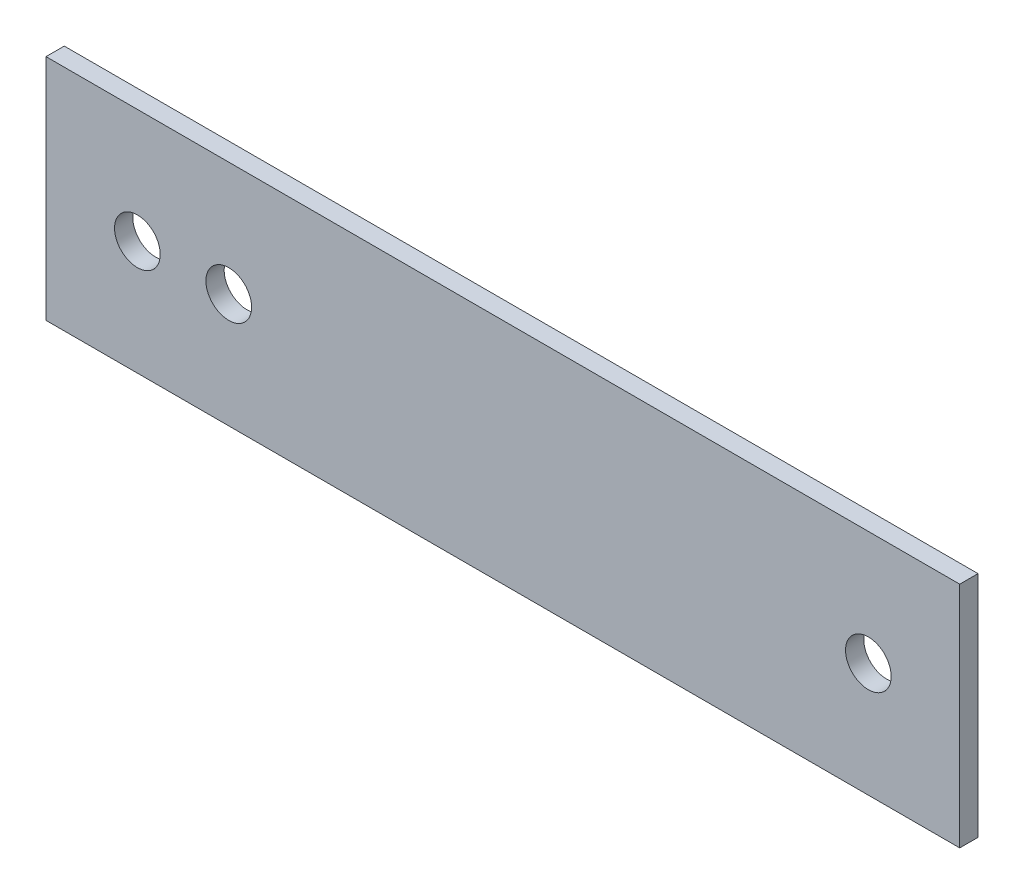
ISO-10303-21;
HEADER;
FILE_DESCRIPTION(('STEP AP214'),'2;1');
FILE_NAME('part.step','',(''),(''),'','','');
FILE_SCHEMA(('AUTOMOTIVE_DESIGN { 1 0 10303 214 1 1 1 1 }'));
ENDSEC;
DATA;
#1=APPLICATION_CONTEXT('core data for automotive mechanical design processes');
#2=APPLICATION_PROTOCOL_DEFINITION('international standard','automotive_design',2000,#1);
#3=PRODUCT_CONTEXT('',#1,'mechanical');
#4=PRODUCT('Part','Part','',(#3));
#5=PRODUCT_RELATED_PRODUCT_CATEGORY('part','',(#4));
#6=PRODUCT_DEFINITION_FORMATION('','',#4);
#7=PRODUCT_DEFINITION_CONTEXT('part definition',#1,'design');
#8=PRODUCT_DEFINITION('design','',#6,#7);
#9=PRODUCT_DEFINITION_SHAPE('','',#8);
#10=(LENGTH_UNIT() NAMED_UNIT(*) SI_UNIT(.MILLI.,.METRE.));
#11=(NAMED_UNIT(*) PLANE_ANGLE_UNIT() SI_UNIT($,.RADIAN.));
#12=(NAMED_UNIT(*) SI_UNIT($,.STERADIAN.) SOLID_ANGLE_UNIT());
#13=UNCERTAINTY_MEASURE_WITH_UNIT(LENGTH_MEASURE(1.E-05),#10,'distance_accuracy_value','');
#14=(GEOMETRIC_REPRESENTATION_CONTEXT(3) GLOBAL_UNCERTAINTY_ASSIGNED_CONTEXT((#13)) GLOBAL_UNIT_ASSIGNED_CONTEXT((#10,
#11,#12)) REPRESENTATION_CONTEXT('',''));
#15=CARTESIAN_POINT('',(0.,0.,0.));
#16=DIRECTION('',(0.,0.,1.));
#17=DIRECTION('',(1.,0.,0.));
#18=AXIS2_PLACEMENT_3D('',#15,#16,#17);
#19=CARTESIAN_POINT('',(0.,0.,2.));
#20=DIRECTION('',(0.,0.,1.));
#21=DIRECTION('',(1.,0.,0.));
#22=AXIS2_PLACEMENT_3D('',#19,#20,#21);
#23=PLANE('',#22);
#24=CARTESIAN_POINT('',(-8.88960426693684,-2.80448717948718,2.));
#25=DIRECTION('',(0.,0.,1.));
#26=DIRECTION('',(1.,0.,0.));
#27=AXIS2_PLACEMENT_3D('',#24,#25,#26);
#28=CIRCLE('',#27,2.5);
#29=CARTESIAN_POINT('',(-6.38960426693684,-2.80448717948718,2.));
#30=VERTEX_POINT('',#29);
#31=EDGE_CURVE('E134',#30,#30,#28,.T.);
#32=ORIENTED_EDGE('',*,*,#31,.F.);
#33=EDGE_LOOP('',(#32));
#34=FACE_BOUND('',#33,.T.);
#35=DIRECTION('',(0.,-1.,0.));
#36=VECTOR('',#35,1.);
#37=CARTESIAN_POINT('',(-28.8896042669368,9.69551282051282,2.));
#38=LINE('',#37,#36);
#39=CARTESIAN_POINT('',(-28.8896042669368,9.69551282051282,2.));
#40=VERTEX_POINT('',#39);
#41=CARTESIAN_POINT('',(-28.8896042669368,-15.3044871794872,2.));
#42=VERTEX_POINT('',#41);
#43=EDGE_CURVE('E92',#40,#42,#38,.T.);
#44=ORIENTED_EDGE('',*,*,#43,.T.);
#45=DIRECTION('',(1.,0.,0.));
#46=VECTOR('',#45,1.);
#47=CARTESIAN_POINT('',(-28.8896042669368,-15.3044871794872,2.));
#48=LINE('',#47,#46);
#49=CARTESIAN_POINT('',(71.1103957330632,-15.3044871794872,2.));
#50=VERTEX_POINT('',#49);
#51=EDGE_CURVE('E87',#42,#50,#48,.T.);
#52=ORIENTED_EDGE('',*,*,#51,.T.);
#53=DIRECTION('',(0.,1.,0.));
#54=VECTOR('',#53,1.);
#55=CARTESIAN_POINT('',(71.1103957330632,9.69551282051282,2.));
#56=LINE('',#55,#54);
#57=CARTESIAN_POINT('',(71.1103957330632,9.69551282051282,2.));
#58=VERTEX_POINT('',#57);
#59=EDGE_CURVE('E90',#50,#58,#56,.T.);
#60=ORIENTED_EDGE('',*,*,#59,.T.);
#61=DIRECTION('',(-1.,0.,0.));
#62=VECTOR('',#61,1.);
#63=CARTESIAN_POINT('',(-28.8896042669368,9.69551282051282,2.));
#64=LINE('',#63,#62);
#65=EDGE_CURVE('E57',#58,#40,#64,.T.);
#66=ORIENTED_EDGE('',*,*,#65,.T.);
#67=EDGE_LOOP('',(#44,#52,#60,#66));
#68=FACE_BOUND('',#67,.T.);
#69=CARTESIAN_POINT('',(-18.8896042669368,-2.80448717948718,2.));
#70=DIRECTION('',(0.,0.,1.));
#71=DIRECTION('',(1.,0.,0.));
#72=AXIS2_PLACEMENT_3D('',#69,#70,#71);
#73=CIRCLE('',#72,2.5);
#74=CARTESIAN_POINT('',(-16.3896042669368,-2.80448717948718,2.));
#75=VERTEX_POINT('',#74);
#76=EDGE_CURVE('E112',#75,#75,#73,.T.);
#77=ORIENTED_EDGE('',*,*,#76,.F.);
#78=EDGE_LOOP('',(#77));
#79=FACE_BOUND('',#78,.T.);
#80=CARTESIAN_POINT('',(61.1103957330632,-2.80448717948718,2.));
#81=DIRECTION('',(0.,0.,1.));
#82=DIRECTION('',(1.,0.,0.));
#83=AXIS2_PLACEMENT_3D('',#80,#81,#82);
#84=CIRCLE('',#83,2.5);
#85=CARTESIAN_POINT('',(63.6103957330632,-2.80448717948718,2.));
#86=VERTEX_POINT('',#85);
#87=EDGE_CURVE('E142',#86,#86,#84,.T.);
#88=ORIENTED_EDGE('',*,*,#87,.F.);
#89=EDGE_LOOP('',(#88));
#90=FACE_BOUND('',#89,.T.);
#91=ADVANCED_FACE('F39',(#34,#68,#79,#90),#23,.T.);
#92=CARTESIAN_POINT('',(0.,0.,0.));
#93=DIRECTION('',(0.,0.,1.));
#94=DIRECTION('',(1.,0.,0.));
#95=AXIS2_PLACEMENT_3D('',#92,#93,#94);
#96=PLANE('',#95);
#97=DIRECTION('',(0.,-1.,0.));
#98=VECTOR('',#97,1.);
#99=CARTESIAN_POINT('',(-28.8896042669368,9.69551282051282,0.));
#100=LINE('',#99,#98);
#101=CARTESIAN_POINT('',(-28.8896042669368,9.69551282051282,0.));
#102=VERTEX_POINT('',#101);
#103=CARTESIAN_POINT('',(-28.8896042669368,-15.3044871794872,0.));
#104=VERTEX_POINT('',#103);
#105=EDGE_CURVE('E108',#102,#104,#100,.T.);
#106=ORIENTED_EDGE('',*,*,#105,.F.);
#107=DIRECTION('',(-1.,0.,0.));
#108=VECTOR('',#107,1.);
#109=CARTESIAN_POINT('',(-28.8896042669368,9.69551282051282,0.));
#110=LINE('',#109,#108);
#111=CARTESIAN_POINT('',(71.1103957330632,9.69551282051282,0.));
#112=VERTEX_POINT('',#111);
#113=EDGE_CURVE('E80',#112,#102,#110,.T.);
#114=ORIENTED_EDGE('',*,*,#113,.F.);
#115=DIRECTION('',(0.,1.,0.));
#116=VECTOR('',#115,1.);
#117=CARTESIAN_POINT('',(71.1103957330632,9.69551282051282,0.));
#118=LINE('',#117,#116);
#119=CARTESIAN_POINT('',(71.1103957330632,-15.3044871794872,0.));
#120=VERTEX_POINT('',#119);
#121=EDGE_CURVE('E74',#120,#112,#118,.T.);
#122=ORIENTED_EDGE('',*,*,#121,.F.);
#123=DIRECTION('',(1.,0.,0.));
#124=VECTOR('',#123,1.);
#125=CARTESIAN_POINT('',(-28.8896042669368,-15.3044871794872,0.));
#126=LINE('',#125,#124);
#127=EDGE_CURVE('E97',#104,#120,#126,.T.);
#128=ORIENTED_EDGE('',*,*,#127,.F.);
#129=EDGE_LOOP('',(#106,#114,#122,#128));
#130=FACE_BOUND('',#129,.T.);
#131=CARTESIAN_POINT('',(-18.8896042669368,-2.80448717948718,0.));
#132=DIRECTION('',(0.,0.,1.));
#133=DIRECTION('',(1.,0.,0.));
#134=AXIS2_PLACEMENT_3D('',#131,#132,#133);
#135=CIRCLE('',#134,2.5);
#136=CARTESIAN_POINT('',(-16.3896042669368,-2.80448717948718,0.));
#137=VERTEX_POINT('',#136);
#138=EDGE_CURVE('E130',#137,#137,#135,.T.);
#139=ORIENTED_EDGE('',*,*,#138,.T.);
#140=EDGE_LOOP('',(#139));
#141=FACE_BOUND('',#140,.T.);
#142=CARTESIAN_POINT('',(-8.88960426693684,-2.80448717948718,0.));
#143=DIRECTION('',(0.,0.,1.));
#144=DIRECTION('',(1.,0.,0.));
#145=AXIS2_PLACEMENT_3D('',#142,#143,#144);
#146=CIRCLE('',#145,2.5);
#147=CARTESIAN_POINT('',(-6.38960426693684,-2.80448717948718,0.));
#148=VERTEX_POINT('',#147);
#149=EDGE_CURVE('E138',#148,#148,#146,.T.);
#150=ORIENTED_EDGE('',*,*,#149,.T.);
#151=EDGE_LOOP('',(#150));
#152=FACE_BOUND('',#151,.T.);
#153=CARTESIAN_POINT('',(61.1103957330632,-2.80448717948718,0.));
#154=DIRECTION('',(0.,0.,1.));
#155=DIRECTION('',(1.,0.,0.));
#156=AXIS2_PLACEMENT_3D('',#153,#154,#155);
#157=CIRCLE('',#156,2.5);
#158=CARTESIAN_POINT('',(63.6103957330632,-2.80448717948718,0.));
#159=VERTEX_POINT('',#158);
#160=EDGE_CURVE('E146',#159,#159,#157,.T.);
#161=ORIENTED_EDGE('',*,*,#160,.T.);
#162=EDGE_LOOP('',(#161));
#163=FACE_BOUND('',#162,.T.);
#164=ADVANCED_FACE('F125',(#130,#141,#152,#163),#96,.F.);
#165=CARTESIAN_POINT('',(-28.8896042669368,9.69551282051282,2.));
#166=DIRECTION('',(1.,0.,0.));
#167=DIRECTION('',(0.,0.,-1.));
#168=AXIS2_PLACEMENT_3D('',#165,#166,#167);
#169=PLANE('',#168);
#170=ORIENTED_EDGE('',*,*,#105,.T.);
#171=DIRECTION('',(0.,0.,-1.));
#172=VECTOR('',#171,1.);
#173=CARTESIAN_POINT('',(-28.8896042669368,-15.3044871794872,2.));
#174=LINE('',#173,#172);
#175=EDGE_CURVE('E11',#42,#104,#174,.T.);
#176=ORIENTED_EDGE('',*,*,#175,.F.);
#177=ORIENTED_EDGE('',*,*,#43,.F.);
#178=DIRECTION('',(0.,0.,-1.));
#179=VECTOR('',#178,1.);
#180=CARTESIAN_POINT('',(-28.8896042669368,9.69551282051282,2.));
#181=LINE('',#180,#179);
#182=EDGE_CURVE('E104',#40,#102,#181,.T.);
#183=ORIENTED_EDGE('',*,*,#182,.T.);
#184=EDGE_LOOP('',(#170,#176,#177,#183));
#185=FACE_BOUND('',#184,.T.);
#186=ADVANCED_FACE('F41',(#185),#169,.F.);
#187=CARTESIAN_POINT('',(-28.8896042669368,-15.3044871794872,2.));
#188=DIRECTION('',(0.,1.,0.));
#189=DIRECTION('',(-1.,0.,0.));
#190=AXIS2_PLACEMENT_3D('',#187,#188,#189);
#191=PLANE('',#190);
#192=ORIENTED_EDGE('',*,*,#127,.T.);
#193=DIRECTION('',(0.,0.,-1.));
#194=VECTOR('',#193,1.);
#195=CARTESIAN_POINT('',(71.1103957330632,-15.3044871794872,2.));
#196=LINE('',#195,#194);
#197=EDGE_CURVE('E49',#50,#120,#196,.T.);
#198=ORIENTED_EDGE('',*,*,#197,.F.);
#199=ORIENTED_EDGE('',*,*,#51,.F.);
#200=ORIENTED_EDGE('',*,*,#175,.T.);
#201=EDGE_LOOP('',(#192,#198,#199,#200));
#202=FACE_BOUND('',#201,.T.);
#203=ADVANCED_FACE('F96',(#202),#191,.F.);
#204=CARTESIAN_POINT('',(71.1103957330632,9.69551282051282,2.));
#205=DIRECTION('',(-1.,0.,0.));
#206=DIRECTION('',(0.,0.,1.));
#207=AXIS2_PLACEMENT_3D('',#204,#205,#206);
#208=PLANE('',#207);
#209=ORIENTED_EDGE('',*,*,#121,.T.);
#210=DIRECTION('',(0.,0.,-1.));
#211=VECTOR('',#210,1.);
#212=CARTESIAN_POINT('',(71.1103957330632,9.69551282051282,2.));
#213=LINE('',#212,#211);
#214=EDGE_CURVE('E99',#58,#112,#213,.T.);
#215=ORIENTED_EDGE('',*,*,#214,.F.);
#216=ORIENTED_EDGE('',*,*,#59,.F.);
#217=ORIENTED_EDGE('',*,*,#197,.T.);
#218=EDGE_LOOP('',(#209,#215,#216,#217));
#219=FACE_BOUND('',#218,.T.);
#220=ADVANCED_FACE('F100',(#219),#208,.F.);
#221=CARTESIAN_POINT('',(-28.8896042669368,9.69551282051282,2.));
#222=DIRECTION('',(0.,-1.,0.));
#223=DIRECTION('',(0.,0.,-1.));
#224=AXIS2_PLACEMENT_3D('',#221,#222,#223);
#225=PLANE('',#224);
#226=ORIENTED_EDGE('',*,*,#113,.T.);
#227=ORIENTED_EDGE('',*,*,#182,.F.);
#228=ORIENTED_EDGE('',*,*,#65,.F.);
#229=ORIENTED_EDGE('',*,*,#214,.T.);
#230=EDGE_LOOP('',(#226,#227,#228,#229));
#231=FACE_BOUND('',#230,.T.);
#232=ADVANCED_FACE('F122',(#231),#225,.F.);
#233=CARTESIAN_POINT('',(-18.8896042669368,-2.80448717948718,2.));
#234=DIRECTION('',(0.,0.,-1.));
#235=DIRECTION('',(-1.,0.,0.));
#236=AXIS2_PLACEMENT_3D('',#233,#234,#235);
#237=CYLINDRICAL_SURFACE('',#236,2.5);
#238=ORIENTED_EDGE('',*,*,#76,.T.);
#239=EDGE_LOOP('',(#238));
#240=FACE_BOUND('',#239,.T.);
#241=ORIENTED_EDGE('',*,*,#138,.F.);
#242=EDGE_LOOP('',(#241));
#243=FACE_BOUND('',#242,.T.);
#244=ADVANCED_FACE('F166',(#240,#243),#237,.F.);
#245=CARTESIAN_POINT('',(-8.88960426693684,-2.80448717948718,2.));
#246=DIRECTION('',(0.,0.,-1.));
#247=DIRECTION('',(-1.,0.,0.));
#248=AXIS2_PLACEMENT_3D('',#245,#246,#247);
#249=CYLINDRICAL_SURFACE('',#248,2.5);
#250=ORIENTED_EDGE('',*,*,#31,.T.);
#251=EDGE_LOOP('',(#250));
#252=FACE_BOUND('',#251,.T.);
#253=ORIENTED_EDGE('',*,*,#149,.F.);
#254=EDGE_LOOP('',(#253));
#255=FACE_BOUND('',#254,.T.);
#256=ADVANCED_FACE('F212',(#252,#255),#249,.F.);
#257=CARTESIAN_POINT('',(61.1103957330632,-2.80448717948718,2.));
#258=DIRECTION('',(0.,0.,-1.));
#259=DIRECTION('',(-1.,0.,0.));
#260=AXIS2_PLACEMENT_3D('',#257,#258,#259);
#261=CYLINDRICAL_SURFACE('',#260,2.5);
#262=ORIENTED_EDGE('',*,*,#87,.T.);
#263=EDGE_LOOP('',(#262));
#264=FACE_BOUND('',#263,.T.);
#265=ORIENTED_EDGE('',*,*,#160,.F.);
#266=EDGE_LOOP('',(#265));
#267=FACE_BOUND('',#266,.T.);
#268=ADVANCED_FACE('F154',(#264,#267),#261,.F.);
#269=CLOSED_SHELL('',(#91,#164,#186,#203,#220,#232,#244,#256,#268));
#270=MANIFOLD_SOLID_BREP('B2',#269);
#271=ADVANCED_BREP_SHAPE_REPRESENTATION('',(#18,#270),#14);
#272=SHAPE_DEFINITION_REPRESENTATION(#9,#271);
ENDSEC;
END-ISO-10303-21;
